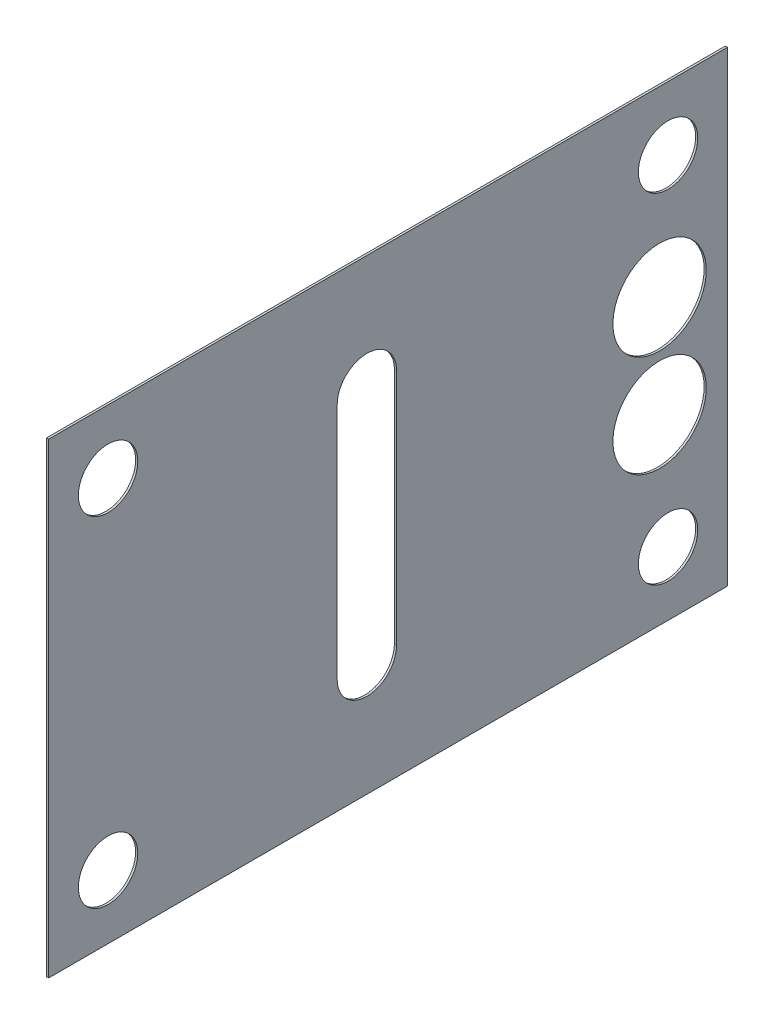
ISO-10303-21;
HEADER;
FILE_DESCRIPTION(('STEP AP214'),'2;1');
FILE_NAME('part.step','',(''),(''),'','','');
FILE_SCHEMA(('AUTOMOTIVE_DESIGN { 1 0 10303 214 1 1 1 1 }'));
ENDSEC;
DATA;
#1=APPLICATION_CONTEXT('core data for automotive mechanical design processes');
#2=APPLICATION_PROTOCOL_DEFINITION('international standard','automotive_design',2000,#1);
#3=PRODUCT_CONTEXT('',#1,'mechanical');
#4=PRODUCT('Part','Part','',(#3));
#5=PRODUCT_RELATED_PRODUCT_CATEGORY('part','',(#4));
#6=PRODUCT_DEFINITION_FORMATION('','',#4);
#7=PRODUCT_DEFINITION_CONTEXT('part definition',#1,'design');
#8=PRODUCT_DEFINITION('design','',#6,#7);
#9=PRODUCT_DEFINITION_SHAPE('','',#8);
#10=(LENGTH_UNIT() NAMED_UNIT(*) SI_UNIT(.MILLI.,.METRE.));
#11=(NAMED_UNIT(*) PLANE_ANGLE_UNIT() SI_UNIT($,.RADIAN.));
#12=(NAMED_UNIT(*) SI_UNIT($,.STERADIAN.) SOLID_ANGLE_UNIT());
#13=UNCERTAINTY_MEASURE_WITH_UNIT(LENGTH_MEASURE(1.E-05),#10,'distance_accuracy_value','');
#14=(GEOMETRIC_REPRESENTATION_CONTEXT(3) GLOBAL_UNCERTAINTY_ASSIGNED_CONTEXT((#13)) GLOBAL_UNIT_ASSIGNED_CONTEXT((#10,
#11,#12)) REPRESENTATION_CONTEXT('',''));
#15=CARTESIAN_POINT('',(0.,0.,0.));
#16=DIRECTION('',(0.,0.,1.));
#17=DIRECTION('',(1.,0.,0.));
#18=AXIS2_PLACEMENT_3D('',#15,#16,#17);
#19=CARTESIAN_POINT('',(0.508,55.,80.));
#20=DIRECTION('',(0.,0.,-1.));
#21=DIRECTION('',(-1.,0.,0.));
#22=AXIS2_PLACEMENT_3D('',#19,#20,#21);
#23=PLANE('',#22);
#24=DIRECTION('',(0.,-1.,0.));
#25=VECTOR('',#24,1.);
#26=CARTESIAN_POINT('',(0.,55.,80.));
#27=LINE('',#26,#25);
#28=CARTESIAN_POINT('',(0.,55.,80.));
#29=VERTEX_POINT('',#28);
#30=CARTESIAN_POINT('',(0.,-55.,80.));
#31=VERTEX_POINT('',#30);
#32=EDGE_CURVE('E161',#29,#31,#27,.T.);
#33=ORIENTED_EDGE('',*,*,#32,.T.);
#34=DIRECTION('',(-1.,0.,0.));
#35=VECTOR('',#34,1.);
#36=CARTESIAN_POINT('',(0.508,-55.,80.));
#37=LINE('',#36,#35);
#38=CARTESIAN_POINT('',(0.508,-55.,80.));
#39=VERTEX_POINT('',#38);
#40=EDGE_CURVE('E11',#39,#31,#37,.T.);
#41=ORIENTED_EDGE('',*,*,#40,.F.);
#42=DIRECTION('',(0.,-1.,0.));
#43=VECTOR('',#42,1.);
#44=CARTESIAN_POINT('',(0.508,55.,80.));
#45=LINE('',#44,#43);
#46=CARTESIAN_POINT('',(0.508,55.,80.));
#47=VERTEX_POINT('',#46);
#48=EDGE_CURVE('E162',#47,#39,#45,.T.);
#49=ORIENTED_EDGE('',*,*,#48,.F.);
#50=DIRECTION('',(-1.,0.,0.));
#51=VECTOR('',#50,1.);
#52=CARTESIAN_POINT('',(0.508,55.,80.));
#53=LINE('',#52,#51);
#54=EDGE_CURVE('E172',#47,#29,#53,.T.);
#55=ORIENTED_EDGE('',*,*,#54,.T.);
#56=EDGE_LOOP('',(#33,#41,#49,#55));
#57=FACE_BOUND('',#56,.T.);
#58=ADVANCED_FACE('F34',(#57),#23,.F.);
#59=CARTESIAN_POINT('',(0.508,-55.,80.));
#60=DIRECTION('',(0.,1.,0.));
#61=DIRECTION('',(0.,0.,1.));
#62=AXIS2_PLACEMENT_3D('',#59,#60,#61);
#63=PLANE('',#62);
#64=DIRECTION('',(0.,0.,-1.));
#65=VECTOR('',#64,1.);
#66=CARTESIAN_POINT('',(0.,-55.,80.));
#67=LINE('',#66,#65);
#68=CARTESIAN_POINT('',(0.,-55.,-80.));
#69=VERTEX_POINT('',#68);
#70=EDGE_CURVE('E175',#31,#69,#67,.T.);
#71=ORIENTED_EDGE('',*,*,#70,.T.);
#72=DIRECTION('',(-1.,0.,0.));
#73=VECTOR('',#72,1.);
#74=CARTESIAN_POINT('',(0.508,-55.,-80.));
#75=LINE('',#74,#73);
#76=CARTESIAN_POINT('',(0.508,-55.,-80.));
#77=VERTEX_POINT('',#76);
#78=EDGE_CURVE('E41',#77,#69,#75,.T.);
#79=ORIENTED_EDGE('',*,*,#78,.F.);
#80=DIRECTION('',(0.,0.,-1.));
#81=VECTOR('',#80,1.);
#82=CARTESIAN_POINT('',(0.508,-55.,80.));
#83=LINE('',#82,#81);
#84=EDGE_CURVE('E165',#39,#77,#83,.T.);
#85=ORIENTED_EDGE('',*,*,#84,.F.);
#86=ORIENTED_EDGE('',*,*,#40,.T.);
#87=EDGE_LOOP('',(#71,#79,#85,#86));
#88=FACE_BOUND('',#87,.T.);
#89=ADVANCED_FACE('F204',(#88),#63,.F.);
#90=CARTESIAN_POINT('',(0.508,55.,-80.));
#91=DIRECTION('',(0.,0.,1.));
#92=DIRECTION('',(0.,-1.,0.));
#93=AXIS2_PLACEMENT_3D('',#90,#91,#92);
#94=PLANE('',#93);
#95=DIRECTION('',(0.,1.,0.));
#96=VECTOR('',#95,1.);
#97=CARTESIAN_POINT('',(0.,55.,-80.));
#98=LINE('',#97,#96);
#99=CARTESIAN_POINT('',(0.,55.,-80.));
#100=VERTEX_POINT('',#99);
#101=EDGE_CURVE('E177',#69,#100,#98,.T.);
#102=ORIENTED_EDGE('',*,*,#101,.T.);
#103=DIRECTION('',(-1.,0.,0.));
#104=VECTOR('',#103,1.);
#105=CARTESIAN_POINT('',(0.508,55.,-80.));
#106=LINE('',#105,#104);
#107=CARTESIAN_POINT('',(0.508,55.,-80.));
#108=VERTEX_POINT('',#107);
#109=EDGE_CURVE('E182',#108,#100,#106,.T.);
#110=ORIENTED_EDGE('',*,*,#109,.F.);
#111=DIRECTION('',(0.,1.,0.));
#112=VECTOR('',#111,1.);
#113=CARTESIAN_POINT('',(0.508,55.,-80.));
#114=LINE('',#113,#112);
#115=EDGE_CURVE('E168',#77,#108,#114,.T.);
#116=ORIENTED_EDGE('',*,*,#115,.F.);
#117=ORIENTED_EDGE('',*,*,#78,.T.);
#118=EDGE_LOOP('',(#102,#110,#116,#117));
#119=FACE_BOUND('',#118,.T.);
#120=ADVANCED_FACE('F189',(#119),#94,.F.);
#121=CARTESIAN_POINT('',(0.508,55.,80.));
#122=DIRECTION('',(0.,-1.,0.));
#123=DIRECTION('',(0.,0.,-1.));
#124=AXIS2_PLACEMENT_3D('',#121,#122,#123);
#125=PLANE('',#124);
#126=DIRECTION('',(0.,0.,1.));
#127=VECTOR('',#126,1.);
#128=CARTESIAN_POINT('',(0.,55.,80.));
#129=LINE('',#128,#127);
#130=EDGE_CURVE('E166',#100,#29,#129,.T.);
#131=ORIENTED_EDGE('',*,*,#130,.T.);
#132=ORIENTED_EDGE('',*,*,#54,.F.);
#133=DIRECTION('',(0.,0.,1.));
#134=VECTOR('',#133,1.);
#135=CARTESIAN_POINT('',(0.508,55.,80.));
#136=LINE('',#135,#134);
#137=EDGE_CURVE('E170',#108,#47,#136,.T.);
#138=ORIENTED_EDGE('',*,*,#137,.F.);
#139=ORIENTED_EDGE('',*,*,#109,.T.);
#140=EDGE_LOOP('',(#131,#132,#138,#139));
#141=FACE_BOUND('',#140,.T.);
#142=ADVANCED_FACE('F197',(#141),#125,.F.);
#143=CARTESIAN_POINT('',(0.508,0.,0.));
#144=DIRECTION('',(1.,0.,0.));
#145=DIRECTION('',(0.,0.,-1.));
#146=AXIS2_PLACEMENT_3D('',#143,#144,#145);
#147=PLANE('',#146);
#148=CARTESIAN_POINT('',(0.507999999999999,12.,-64.));
#149=DIRECTION('',(1.,0.,0.));
#150=DIRECTION('',(0.,0.,-1.));
#151=AXIS2_PLACEMENT_3D('',#148,#149,#150);
#152=CIRCLE('',#151,11.);
#153=CARTESIAN_POINT('',(0.507999999999999,12.,-75.));
#154=VERTEX_POINT('',#153);
#155=EDGE_CURVE('E262',#154,#154,#152,.T.);
#156=ORIENTED_EDGE('',*,*,#155,.F.);
#157=EDGE_LOOP('',(#156));
#158=FACE_BOUND('',#157,.T.);
#159=CARTESIAN_POINT('',(0.507999999999999,-12.,-64.));
#160=DIRECTION('',(1.,0.,0.));
#161=DIRECTION('',(0.,0.,-1.));
#162=AXIS2_PLACEMENT_3D('',#159,#160,#161);
#163=CIRCLE('',#162,11.);
#164=CARTESIAN_POINT('',(0.507999999999999,-12.,-75.));
#165=VERTEX_POINT('',#164);
#166=EDGE_CURVE('E264',#165,#165,#163,.T.);
#167=ORIENTED_EDGE('',*,*,#166,.F.);
#168=EDGE_LOOP('',(#167));
#169=FACE_BOUND('',#168,.T.);
#170=CARTESIAN_POINT('',(0.508,28.,5.));
#171=DIRECTION('',(1.,0.,0.));
#172=DIRECTION('',(0.,0.,-1.));
#173=AXIS2_PLACEMENT_3D('',#170,#171,#172);
#174=CIRCLE('',#173,6.99999999999999);
#175=CARTESIAN_POINT('',(0.508,28.,-1.99999999999998));
#176=VERTEX_POINT('',#175);
#177=CARTESIAN_POINT('',(0.508,28.,12.));
#178=VERTEX_POINT('',#177);
#179=EDGE_CURVE('E48',#176,#178,#174,.T.);
#180=ORIENTED_EDGE('',*,*,#179,.F.);
#181=DIRECTION('',(0.,1.,0.));
#182=VECTOR('',#181,1.);
#183=CARTESIAN_POINT('',(0.508,28.,-1.99999999999998));
#184=LINE('',#183,#182);
#185=CARTESIAN_POINT('',(0.508,-28.,-2.));
#186=VERTEX_POINT('',#185);
#187=EDGE_CURVE('E116',#186,#176,#184,.T.);
#188=ORIENTED_EDGE('',*,*,#187,.F.);
#189=CARTESIAN_POINT('',(0.508,-28.,5.));
#190=DIRECTION('',(1.,0.,0.));
#191=DIRECTION('',(0.,0.,-1.));
#192=AXIS2_PLACEMENT_3D('',#189,#190,#191);
#193=CIRCLE('',#192,7.);
#194=CARTESIAN_POINT('',(0.508,-28.,12.));
#195=VERTEX_POINT('',#194);
#196=EDGE_CURVE('E119',#195,#186,#193,.T.);
#197=ORIENTED_EDGE('',*,*,#196,.F.);
#198=DIRECTION('',(0.,-1.,0.));
#199=VECTOR('',#198,1.);
#200=CARTESIAN_POINT('',(0.508,28.,12.));
#201=LINE('',#200,#199);
#202=EDGE_CURVE('E128',#178,#195,#201,.T.);
#203=ORIENTED_EDGE('',*,*,#202,.F.);
#204=EDGE_LOOP('',(#180,#188,#197,#203));
#205=FACE_BOUND('',#204,.T.);
#206=CARTESIAN_POINT('',(0.508,40.,66.));
#207=DIRECTION('',(1.,0.,0.));
#208=DIRECTION('',(0.,0.,-1.));
#209=AXIS2_PLACEMENT_3D('',#206,#207,#208);
#210=CIRCLE('',#209,7.);
#211=CARTESIAN_POINT('',(0.508,40.,59.));
#212=VERTEX_POINT('',#211);
#213=EDGE_CURVE('E134',#212,#212,#210,.T.);
#214=ORIENTED_EDGE('',*,*,#213,.F.);
#215=EDGE_LOOP('',(#214));
#216=FACE_BOUND('',#215,.T.);
#217=CARTESIAN_POINT('',(0.508,40.,-66.));
#218=DIRECTION('',(1.,0.,0.));
#219=DIRECTION('',(0.,0.,-1.));
#220=AXIS2_PLACEMENT_3D('',#217,#218,#219);
#221=CIRCLE('',#220,7.);
#222=CARTESIAN_POINT('',(0.508,40.,-73.));
#223=VERTEX_POINT('',#222);
#224=EDGE_CURVE('E143',#223,#223,#221,.T.);
#225=ORIENTED_EDGE('',*,*,#224,.F.);
#226=EDGE_LOOP('',(#225));
#227=FACE_BOUND('',#226,.T.);
#228=CARTESIAN_POINT('',(0.508,-40.,-66.));
#229=DIRECTION('',(1.,0.,0.));
#230=DIRECTION('',(0.,0.,-1.));
#231=AXIS2_PLACEMENT_3D('',#228,#229,#230);
#232=CIRCLE('',#231,7.);
#233=CARTESIAN_POINT('',(0.508,-40.,-73.));
#234=VERTEX_POINT('',#233);
#235=EDGE_CURVE('E149',#234,#234,#232,.T.);
#236=ORIENTED_EDGE('',*,*,#235,.F.);
#237=EDGE_LOOP('',(#236));
#238=FACE_BOUND('',#237,.T.);
#239=CARTESIAN_POINT('',(0.508,-40.,66.));
#240=DIRECTION('',(1.,0.,0.));
#241=DIRECTION('',(0.,0.,-1.));
#242=AXIS2_PLACEMENT_3D('',#239,#240,#241);
#243=CIRCLE('',#242,7.);
#244=CARTESIAN_POINT('',(0.508,-40.,59.));
#245=VERTEX_POINT('',#244);
#246=EDGE_CURVE('E155',#245,#245,#243,.T.);
#247=ORIENTED_EDGE('',*,*,#246,.F.);
#248=EDGE_LOOP('',(#247));
#249=FACE_BOUND('',#248,.T.);
#250=ORIENTED_EDGE('',*,*,#48,.T.);
#251=ORIENTED_EDGE('',*,*,#84,.T.);
#252=ORIENTED_EDGE('',*,*,#115,.T.);
#253=ORIENTED_EDGE('',*,*,#137,.T.);
#254=EDGE_LOOP('',(#250,#251,#252,#253));
#255=FACE_BOUND('',#254,.T.);
#256=ADVANCED_FACE('F203',(#158,#169,#205,#216,#227,#238,#249,#255),#147,.T.);
#257=CARTESIAN_POINT('',(0.,0.,0.));
#258=DIRECTION('',(1.,0.,0.));
#259=DIRECTION('',(0.,0.,-1.));
#260=AXIS2_PLACEMENT_3D('',#257,#258,#259);
#261=PLANE('',#260);
#262=CARTESIAN_POINT('',(0.,12.,-64.));
#263=DIRECTION('',(1.,0.,0.));
#264=DIRECTION('',(0.,0.,-1.));
#265=AXIS2_PLACEMENT_3D('',#262,#263,#264);
#266=CIRCLE('',#265,11.);
#267=CARTESIAN_POINT('',(0.,12.,-75.));
#268=VERTEX_POINT('',#267);
#269=EDGE_CURVE('E259',#268,#268,#266,.T.);
#270=ORIENTED_EDGE('',*,*,#269,.T.);
#271=EDGE_LOOP('',(#270));
#272=FACE_BOUND('',#271,.T.);
#273=CARTESIAN_POINT('',(0.,-12.,-64.));
#274=DIRECTION('',(1.,0.,0.));
#275=DIRECTION('',(0.,0.,-1.));
#276=AXIS2_PLACEMENT_3D('',#273,#274,#275);
#277=CIRCLE('',#276,11.);
#278=CARTESIAN_POINT('',(0.,-12.,-75.));
#279=VERTEX_POINT('',#278);
#280=EDGE_CURVE('E122',#279,#279,#277,.T.);
#281=ORIENTED_EDGE('',*,*,#280,.T.);
#282=EDGE_LOOP('',(#281));
#283=FACE_BOUND('',#282,.T.);
#284=DIRECTION('',(0.,1.,0.));
#285=VECTOR('',#284,1.);
#286=CARTESIAN_POINT('',(0.,28.,-1.99999999999998));
#287=LINE('',#286,#285);
#288=CARTESIAN_POINT('',(0.,-28.,-2.));
#289=VERTEX_POINT('',#288);
#290=CARTESIAN_POINT('',(0.,28.,-1.99999999999998));
#291=VERTEX_POINT('',#290);
#292=EDGE_CURVE('E106',#289,#291,#287,.T.);
#293=ORIENTED_EDGE('',*,*,#292,.T.);
#294=CARTESIAN_POINT('',(0.,28.,5.));
#295=DIRECTION('',(1.,0.,0.));
#296=DIRECTION('',(0.,0.,-1.));
#297=AXIS2_PLACEMENT_3D('',#294,#295,#296);
#298=CIRCLE('',#297,6.99999999999999);
#299=CARTESIAN_POINT('',(0.,28.,12.));
#300=VERTEX_POINT('',#299);
#301=EDGE_CURVE('E100',#291,#300,#298,.T.);
#302=ORIENTED_EDGE('',*,*,#301,.T.);
#303=DIRECTION('',(0.,-1.,0.));
#304=VECTOR('',#303,1.);
#305=CARTESIAN_POINT('',(0.,28.,12.));
#306=LINE('',#305,#304);
#307=CARTESIAN_POINT('',(0.,-28.,12.));
#308=VERTEX_POINT('',#307);
#309=EDGE_CURVE('E109',#300,#308,#306,.T.);
#310=ORIENTED_EDGE('',*,*,#309,.T.);
#311=CARTESIAN_POINT('',(0.,-28.,5.));
#312=DIRECTION('',(1.,0.,0.));
#313=DIRECTION('',(0.,0.,-1.));
#314=AXIS2_PLACEMENT_3D('',#311,#312,#313);
#315=CIRCLE('',#314,7.);
#316=EDGE_CURVE('E56',#308,#289,#315,.T.);
#317=ORIENTED_EDGE('',*,*,#316,.T.);
#318=EDGE_LOOP('',(#293,#302,#310,#317));
#319=FACE_BOUND('',#318,.T.);
#320=CARTESIAN_POINT('',(0.,40.,66.));
#321=DIRECTION('',(1.,0.,0.));
#322=DIRECTION('',(0.,0.,-1.));
#323=AXIS2_PLACEMENT_3D('',#320,#321,#322);
#324=CIRCLE('',#323,7.);
#325=CARTESIAN_POINT('',(0.,40.,59.));
#326=VERTEX_POINT('',#325);
#327=EDGE_CURVE('E140',#326,#326,#324,.T.);
#328=ORIENTED_EDGE('',*,*,#327,.T.);
#329=EDGE_LOOP('',(#328));
#330=FACE_BOUND('',#329,.T.);
#331=CARTESIAN_POINT('',(0.,40.,-66.));
#332=DIRECTION('',(1.,0.,0.));
#333=DIRECTION('',(0.,0.,-1.));
#334=AXIS2_PLACEMENT_3D('',#331,#332,#333);
#335=CIRCLE('',#334,7.);
#336=CARTESIAN_POINT('',(0.,40.,-73.));
#337=VERTEX_POINT('',#336);
#338=EDGE_CURVE('E146',#337,#337,#335,.T.);
#339=ORIENTED_EDGE('',*,*,#338,.T.);
#340=EDGE_LOOP('',(#339));
#341=FACE_BOUND('',#340,.T.);
#342=CARTESIAN_POINT('',(0.,-40.,-66.));
#343=DIRECTION('',(1.,0.,0.));
#344=DIRECTION('',(0.,0.,-1.));
#345=AXIS2_PLACEMENT_3D('',#342,#343,#344);
#346=CIRCLE('',#345,7.);
#347=CARTESIAN_POINT('',(0.,-40.,-73.));
#348=VERTEX_POINT('',#347);
#349=EDGE_CURVE('E152',#348,#348,#346,.T.);
#350=ORIENTED_EDGE('',*,*,#349,.T.);
#351=EDGE_LOOP('',(#350));
#352=FACE_BOUND('',#351,.T.);
#353=CARTESIAN_POINT('',(0.,-40.,66.));
#354=DIRECTION('',(1.,0.,0.));
#355=DIRECTION('',(0.,0.,-1.));
#356=AXIS2_PLACEMENT_3D('',#353,#354,#355);
#357=CIRCLE('',#356,7.);
#358=CARTESIAN_POINT('',(0.,-40.,59.));
#359=VERTEX_POINT('',#358);
#360=EDGE_CURVE('E158',#359,#359,#357,.T.);
#361=ORIENTED_EDGE('',*,*,#360,.T.);
#362=EDGE_LOOP('',(#361));
#363=FACE_BOUND('',#362,.T.);
#364=ORIENTED_EDGE('',*,*,#32,.F.);
#365=ORIENTED_EDGE('',*,*,#130,.F.);
#366=ORIENTED_EDGE('',*,*,#101,.F.);
#367=ORIENTED_EDGE('',*,*,#70,.F.);
#368=EDGE_LOOP('',(#364,#365,#366,#367));
#369=FACE_BOUND('',#368,.T.);
#370=ADVANCED_FACE('F113',(#272,#283,#319,#330,#341,#352,#363,#369),#261,.F.);
#371=CARTESIAN_POINT('',(0.508,-40.,66.));
#372=DIRECTION('',(1.,0.,0.));
#373=DIRECTION('',(0.,0.,-1.));
#374=AXIS2_PLACEMENT_3D('',#371,#372,#373);
#375=CYLINDRICAL_SURFACE('',#374,7.);
#376=ORIENTED_EDGE('',*,*,#360,.F.);
#377=EDGE_LOOP('',(#376));
#378=FACE_BOUND('',#377,.T.);
#379=ORIENTED_EDGE('',*,*,#246,.T.);
#380=EDGE_LOOP('',(#379));
#381=FACE_BOUND('',#380,.T.);
#382=ADVANCED_FACE('F216',(#378,#381),#375,.F.);
#383=CARTESIAN_POINT('',(0.508,-40.,-66.));
#384=DIRECTION('',(1.,0.,0.));
#385=DIRECTION('',(0.,0.,-1.));
#386=AXIS2_PLACEMENT_3D('',#383,#384,#385);
#387=CYLINDRICAL_SURFACE('',#386,7.);
#388=ORIENTED_EDGE('',*,*,#349,.F.);
#389=EDGE_LOOP('',(#388));
#390=FACE_BOUND('',#389,.T.);
#391=ORIENTED_EDGE('',*,*,#235,.T.);
#392=EDGE_LOOP('',(#391));
#393=FACE_BOUND('',#392,.T.);
#394=ADVANCED_FACE('F223',(#390,#393),#387,.F.);
#395=CARTESIAN_POINT('',(0.508,40.,-66.));
#396=DIRECTION('',(1.,0.,0.));
#397=DIRECTION('',(0.,0.,-1.));
#398=AXIS2_PLACEMENT_3D('',#395,#396,#397);
#399=CYLINDRICAL_SURFACE('',#398,7.);
#400=ORIENTED_EDGE('',*,*,#338,.F.);
#401=EDGE_LOOP('',(#400));
#402=FACE_BOUND('',#401,.T.);
#403=ORIENTED_EDGE('',*,*,#224,.T.);
#404=EDGE_LOOP('',(#403));
#405=FACE_BOUND('',#404,.T.);
#406=ADVANCED_FACE('F227',(#402,#405),#399,.F.);
#407=CARTESIAN_POINT('',(0.508,40.,66.));
#408=DIRECTION('',(1.,0.,0.));
#409=DIRECTION('',(0.,0.,-1.));
#410=AXIS2_PLACEMENT_3D('',#407,#408,#409);
#411=CYLINDRICAL_SURFACE('',#410,7.);
#412=ORIENTED_EDGE('',*,*,#327,.F.);
#413=EDGE_LOOP('',(#412));
#414=FACE_BOUND('',#413,.T.);
#415=ORIENTED_EDGE('',*,*,#213,.T.);
#416=EDGE_LOOP('',(#415));
#417=FACE_BOUND('',#416,.T.);
#418=ADVANCED_FACE('F231',(#414,#417),#411,.F.);
#419=CARTESIAN_POINT('',(0.,28.,5.));
#420=DIRECTION('',(1.,0.,0.));
#421=DIRECTION('',(0.,0.,-1.));
#422=AXIS2_PLACEMENT_3D('',#419,#420,#421);
#423=CYLINDRICAL_SURFACE('',#422,6.99999999999999);
#424=ORIENTED_EDGE('',*,*,#179,.T.);
#425=DIRECTION('',(1.,0.,0.));
#426=VECTOR('',#425,1.);
#427=CARTESIAN_POINT('',(0.,28.,12.));
#428=LINE('',#427,#426);
#429=EDGE_CURVE('E96',#300,#178,#428,.T.);
#430=ORIENTED_EDGE('',*,*,#429,.F.);
#431=ORIENTED_EDGE('',*,*,#301,.F.);
#432=DIRECTION('',(1.,0.,0.));
#433=VECTOR('',#432,1.);
#434=CARTESIAN_POINT('',(0.,28.,-1.99999999999998));
#435=LINE('',#434,#433);
#436=EDGE_CURVE('E132',#291,#176,#435,.T.);
#437=ORIENTED_EDGE('',*,*,#436,.T.);
#438=EDGE_LOOP('',(#424,#430,#431,#437));
#439=FACE_BOUND('',#438,.T.);
#440=ADVANCED_FACE('F98',(#439),#423,.F.);
#441=CARTESIAN_POINT('',(0.,28.,-1.99999999999998));
#442=DIRECTION('',(0.,0.,-1.));
#443=DIRECTION('',(0.,1.,0.));
#444=AXIS2_PLACEMENT_3D('',#441,#442,#443);
#445=PLANE('',#444);
#446=ORIENTED_EDGE('',*,*,#187,.T.);
#447=ORIENTED_EDGE('',*,*,#436,.F.);
#448=ORIENTED_EDGE('',*,*,#292,.F.);
#449=DIRECTION('',(1.,0.,0.));
#450=VECTOR('',#449,1.);
#451=CARTESIAN_POINT('',(0.,-28.,-2.));
#452=LINE('',#451,#450);
#453=EDGE_CURVE('E135',#289,#186,#452,.T.);
#454=ORIENTED_EDGE('',*,*,#453,.T.);
#455=EDGE_LOOP('',(#446,#447,#448,#454));
#456=FACE_BOUND('',#455,.T.);
#457=ADVANCED_FACE('F238',(#456),#445,.F.);
#458=CARTESIAN_POINT('',(0.,-28.,5.));
#459=DIRECTION('',(1.,0.,0.));
#460=DIRECTION('',(0.,0.,-1.));
#461=AXIS2_PLACEMENT_3D('',#458,#459,#460);
#462=CYLINDRICAL_SURFACE('',#461,7.);
#463=ORIENTED_EDGE('',*,*,#196,.T.);
#464=ORIENTED_EDGE('',*,*,#453,.F.);
#465=ORIENTED_EDGE('',*,*,#316,.F.);
#466=DIRECTION('',(1.,0.,0.));
#467=VECTOR('',#466,1.);
#468=CARTESIAN_POINT('',(0.,-28.,12.));
#469=LINE('',#468,#467);
#470=EDGE_CURVE('E105',#308,#195,#469,.T.);
#471=ORIENTED_EDGE('',*,*,#470,.T.);
#472=EDGE_LOOP('',(#463,#464,#465,#471));
#473=FACE_BOUND('',#472,.T.);
#474=ADVANCED_FACE('F242',(#473),#462,.F.);
#475=CARTESIAN_POINT('',(0.,28.,12.));
#476=DIRECTION('',(0.,0.,1.));
#477=DIRECTION('',(1.,0.,0.));
#478=AXIS2_PLACEMENT_3D('',#475,#476,#477);
#479=PLANE('',#478);
#480=ORIENTED_EDGE('',*,*,#202,.T.);
#481=ORIENTED_EDGE('',*,*,#470,.F.);
#482=ORIENTED_EDGE('',*,*,#309,.F.);
#483=ORIENTED_EDGE('',*,*,#429,.T.);
#484=EDGE_LOOP('',(#480,#481,#482,#483));
#485=FACE_BOUND('',#484,.T.);
#486=ADVANCED_FACE('F110',(#485),#479,.F.);
#487=CARTESIAN_POINT('',(0.508,-12.,-64.));
#488=DIRECTION('',(1.,0.,0.));
#489=DIRECTION('',(0.,0.,-1.));
#490=AXIS2_PLACEMENT_3D('',#487,#488,#489);
#491=CYLINDRICAL_SURFACE('',#490,11.);
#492=ORIENTED_EDGE('',*,*,#280,.F.);
#493=EDGE_LOOP('',(#492));
#494=FACE_BOUND('',#493,.T.);
#495=ORIENTED_EDGE('',*,*,#166,.T.);
#496=EDGE_LOOP('',(#495));
#497=FACE_BOUND('',#496,.T.);
#498=ADVANCED_FACE('F241',(#494,#497),#491,.F.);
#499=CARTESIAN_POINT('',(0.508,12.,-64.));
#500=DIRECTION('',(1.,0.,0.));
#501=DIRECTION('',(0.,0.,-1.));
#502=AXIS2_PLACEMENT_3D('',#499,#500,#501);
#503=CYLINDRICAL_SURFACE('',#502,11.);
#504=ORIENTED_EDGE('',*,*,#269,.F.);
#505=EDGE_LOOP('',(#504));
#506=FACE_BOUND('',#505,.T.);
#507=ORIENTED_EDGE('',*,*,#155,.T.);
#508=EDGE_LOOP('',(#507));
#509=FACE_BOUND('',#508,.T.);
#510=ADVANCED_FACE('F250',(#506,#509),#503,.F.);
#511=CLOSED_SHELL('',(#58,#89,#120,#142,#256,#370,#382,#394,#406,#418,#440,#457,#474,#486,#498,#510));
#512=MANIFOLD_SOLID_BREP('B2',#511);
#513=ADVANCED_BREP_SHAPE_REPRESENTATION('',(#18,#512),#14);
#514=SHAPE_DEFINITION_REPRESENTATION(#9,#513);
ENDSEC;
END-ISO-10303-21;
